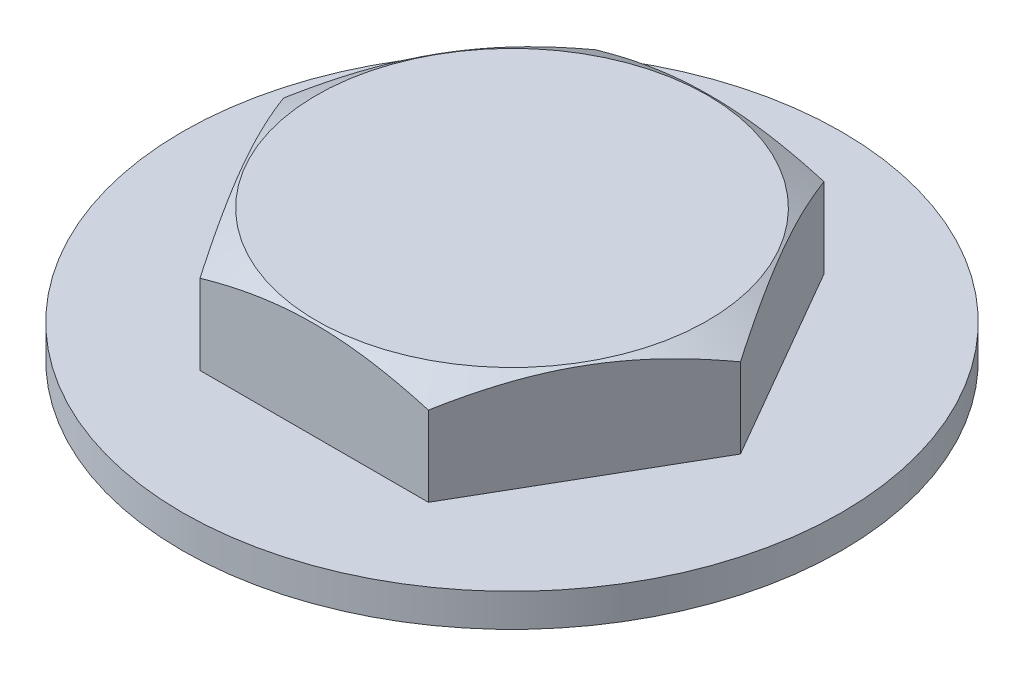
ISO-10303-21;
HEADER;
FILE_DESCRIPTION(('STEP AP214'),'2;1');
FILE_NAME('part.step','',(''),(''),'','','');
FILE_SCHEMA(('AUTOMOTIVE_DESIGN { 1 0 10303 214 1 1 1 1 }'));
ENDSEC;
DATA;
#1=APPLICATION_CONTEXT('core data for automotive mechanical design processes');
#2=APPLICATION_PROTOCOL_DEFINITION('international standard','automotive_design',2000,#1);
#3=PRODUCT_CONTEXT('',#1,'mechanical');
#4=PRODUCT('Part','Part','',(#3));
#5=PRODUCT_RELATED_PRODUCT_CATEGORY('part','',(#4));
#6=PRODUCT_DEFINITION_FORMATION('','',#4);
#7=PRODUCT_DEFINITION_CONTEXT('part definition',#1,'design');
#8=PRODUCT_DEFINITION('design','',#6,#7);
#9=PRODUCT_DEFINITION_SHAPE('','',#8);
#10=(LENGTH_UNIT() NAMED_UNIT(*) SI_UNIT(.MILLI.,.METRE.));
#11=(NAMED_UNIT(*) PLANE_ANGLE_UNIT() SI_UNIT($,.RADIAN.));
#12=(NAMED_UNIT(*) SI_UNIT($,.STERADIAN.) SOLID_ANGLE_UNIT());
#13=UNCERTAINTY_MEASURE_WITH_UNIT(LENGTH_MEASURE(1.E-05),#10,'distance_accuracy_value','');
#14=(GEOMETRIC_REPRESENTATION_CONTEXT(3) GLOBAL_UNCERTAINTY_ASSIGNED_CONTEXT((#13)) GLOBAL_UNIT_ASSIGNED_CONTEXT((#10,
#11,#12)) REPRESENTATION_CONTEXT('',''));
#15=CARTESIAN_POINT('',(0.,0.,0.));
#16=DIRECTION('',(0.,0.,1.));
#17=DIRECTION('',(1.,0.,0.));
#18=AXIS2_PLACEMENT_3D('',#15,#16,#17);
#19=CARTESIAN_POINT('',(6.92820323027551,9.,0.));
#20=DIRECTION('',(-0.866025403784439,0.,0.5));
#21=DIRECTION('',(0.5,0.,0.866025403784439));
#22=AXIS2_PLACEMENT_3D('',#19,#20,#21);
#23=PLANE('',#22);
#24=CARTESIAN_POINT('',(6.92831870032935,8.42258306247708,0.0002));
#25=CARTESIAN_POINT('',(6.85217369681759,8.4665391165567,-0.131687014824875));
#26=CARTESIAN_POINT('',(6.7757447877387,8.50850030845223,-0.264065768516574));
#27=CARTESIAN_POINT('',(6.62226628317934,8.58788353887784,-0.529898336283079));
#28=CARTESIAN_POINT('',(6.54521643511296,8.62530361927698,-0.66335258784951));
#29=CARTESIAN_POINT('',(6.31283321525997,8.73001770558644,-1.06585213146133));
#30=CARTESIAN_POINT('',(6.15658254390819,8.78957805829072,-1.33648623295937));
#31=CARTESIAN_POINT('',(5.92275625451824,8.85941990495739,-1.74148524632806));
#32=CARTESIAN_POINT('',(5.84587929350304,8.87931588762079,-1.87464004873788));
#33=CARTESIAN_POINT('',(5.69177799808122,8.91267870087366,-2.14155132192066));
#34=CARTESIAN_POINT('',(5.6145536949758,8.92614609951375,-2.27530773847834));
#35=CARTESIAN_POINT('',(5.45997096038123,8.94630852392226,-2.54305288876907));
#36=CARTESIAN_POINT('',(5.38261278137647,8.95301123567276,-2.67704118518633));
#37=CARTESIAN_POINT('',(5.22782922676438,8.9595077522625,-2.94513416595058));
#38=CARTESIAN_POINT('',(5.1504038533067,8.95930177052455,-3.07923884657427));
#39=CARTESIAN_POINT('',(4.93828180440546,8.94924093044691,-3.44664501267683));
#40=CARTESIAN_POINT('',(4.80365456051591,8.93235022267034,-3.6798262391765));
#41=CARTESIAN_POINT('',(4.53529425885134,8.87878889288205,-4.14463991639404));
#42=CARTESIAN_POINT('',(4.40156214490546,8.84209996270886,-4.3762707323519));
#43=CARTESIAN_POINT('',(4.13266173796312,8.75038798897692,-4.84201989935197));
#44=CARTESIAN_POINT('',(3.99752737632065,8.69497635896197,-5.07607947956512));
#45=CARTESIAN_POINT('',(3.7292739250165,8.56921420248924,-5.54070808652961));
#46=CARTESIAN_POINT('',(3.59615139973116,8.49889321835646,-5.77128306395569));
#47=CARTESIAN_POINT('',(3.46398614508392,8.42258306247708,-6.0002));
#48=B_SPLINE_CURVE_WITH_KNOTS('',3,(#24,#25,#26,#27,#28,#29,#30,#31,#32,#33,#34,#35,#36,#37,#38,
#39,#40,#41,#42,#43,#44,#45,#46,#47),.UNSPECIFIED.,.F.,.F.,(4,2,2,2,2,2,2,2,2,2,2,4),(0.,
0.475482194578525,0.951168694392475,1.90451835622161,2.36951738073402,2.83447530880776,
3.29890435872167,3.76331906154278,4.57182194271093,5.38107376137307,6.20827406017204,
7.03385036012983),.UNSPECIFIED.);
#49=CARTESIAN_POINT('',(6.92820323027551,8.42264973081038,0.));
#50=VERTEX_POINT('',#49);
#51=CARTESIAN_POINT('',(3.46410161513775,8.42264973081038,-6.));
#52=VERTEX_POINT('',#51);
#53=EDGE_CURVE('E87',#50,#52,#48,.T.);
#54=ORIENTED_EDGE('',*,*,#53,.F.);
#55=DIRECTION('',(0.,-1.,0.));
#56=VECTOR('',#55,1.);
#57=CARTESIAN_POINT('',(6.92820323027551,9.,0.));
#58=LINE('',#57,#56);
#59=CARTESIAN_POINT('',(6.92820323027551,6.,0.));
#60=VERTEX_POINT('',#59);
#61=EDGE_CURVE('E207',#50,#60,#58,.T.);
#62=ORIENTED_EDGE('',*,*,#61,.T.);
#63=DIRECTION('',(-0.5,0.,-0.866025403784439));
#64=VECTOR('',#63,1.);
#65=CARTESIAN_POINT('',(6.92820323027551,6.,0.));
#66=LINE('',#65,#64);
#67=CARTESIAN_POINT('',(3.46410161513776,6.,-6.));
#68=VERTEX_POINT('',#67);
#69=EDGE_CURVE('E96',#60,#68,#66,.T.);
#70=ORIENTED_EDGE('',*,*,#69,.T.);
#71=DIRECTION('',(0.,-1.,0.));
#72=VECTOR('',#71,1.);
#73=CARTESIAN_POINT('',(3.46410161513776,9.,-6.));
#74=LINE('',#73,#72);
#75=EDGE_CURVE('E102',#52,#68,#74,.T.);
#76=ORIENTED_EDGE('',*,*,#75,.F.);
#77=EDGE_LOOP('',(#54,#62,#70,#76));
#78=FACE_BOUND('',#77,.T.);
#79=ADVANCED_FACE('F35',(#78),#23,.F.);
#80=CARTESIAN_POINT('',(3.46410161513776,9.,-6.));
#81=DIRECTION('',(0.,0.,1.));
#82=DIRECTION('',(1.,0.,0.));
#83=AXIS2_PLACEMENT_3D('',#80,#81,#82);
#84=PLANE('',#83);
#85=CARTESIAN_POINT('',(-9.18155979278431,6.0901662730488,-6.));
#86=CARTESIAN_POINT('',(-8.91817057292794,6.21742661186947,-6.00000000000001));
#87=CARTESIAN_POINT('',(-8.65415796087463,6.34342011400239,-6.));
#88=CARTESIAN_POINT('',(-8.1245488596116,6.59214939801971,-6.));
#89=CARTESIAN_POINT('',(-7.85895210517941,6.71488461450858,-6.));
#90=CARTESIAN_POINT('',(-7.32440005407077,6.95702111119331,-6.));
#91=CARTESIAN_POINT('',(-7.05543423199034,7.07639923901043,-6.));
#92=CARTESIAN_POINT('',(-6.51528978405492,7.31001962095316,-6.));
#93=CARTESIAN_POINT('',(-6.24411127463008,7.42426214327798,-6.));
#94=CARTESIAN_POINT('',(-5.69577052259945,7.64759078549939,-6.));
#95=CARTESIAN_POINT('',(-5.41857562669318,7.75659717031044,-6.));
#96=CARTESIAN_POINT('',(-4.8609140407229,7.96605816039962,-6.));
#97=CARTESIAN_POINT('',(-4.58044699032054,8.06651181352566,-6.));
#98=CARTESIAN_POINT('',(-4.01637385547205,8.25616425678339,-6.));
#99=CARTESIAN_POINT('',(-3.73277591464178,8.34538702480316,-6.));
#100=CARTESIAN_POINT('',(-3.16154566557754,8.5096752686121,-6.));
#101=CARTESIAN_POINT('',(-2.87391466593935,8.58474522732167,-6.));
#102=CARTESIAN_POINT('',(-2.2944333403369,8.7170841852823,-6.));
#103=CARTESIAN_POINT('',(-2.00258184290511,8.77434813893941,-6.));
#104=CARTESIAN_POINT('',(-1.41532571311818,8.86720016945625,-6.));
#105=CARTESIAN_POINT('',(-1.11992107657199,8.90278822074593,-6.));
#106=CARTESIAN_POINT('',(-0.676347487619417,8.93763187482261,-6.));
#107=CARTESIAN_POINT('',(-0.528869276347276,8.94615863808684,-6.));
#108=CARTESIAN_POINT('',(-0.23367733354004,8.95696351543254,-6.));
#109=CARTESIAN_POINT('',(-0.085963605064501,8.95924171003672,-6.));
#110=CARTESIAN_POINT('',(0.209383789813805,8.95748809293757,-6.));
#111=CARTESIAN_POINT('',(0.357017467054356,8.9534580450339,-6.));
#112=CARTESIAN_POINT('',(0.651986899102891,8.93918988857407,-6.));
#113=CARTESIAN_POINT('',(0.799322638772218,8.92895147213777,-6.));
#114=CARTESIAN_POINT('',(1.15660382386368,8.89680897735207,-6.));
#115=CARTESIAN_POINT('',(1.36627301023458,8.87178371672604,-6.));
#116=CARTESIAN_POINT('',(1.78400086740359,8.81055021668872,-6.));
#117=CARTESIAN_POINT('',(1.99205908203469,8.77433892055754,-6.));
#118=CARTESIAN_POINT('',(2.40639458979388,8.69201764924662,-6.));
#119=CARTESIAN_POINT('',(2.61267000272928,8.6458983005421,-6.));
#120=CARTESIAN_POINT('',(3.02309673406924,8.54516776349629,-6.));
#121=CARTESIAN_POINT('',(3.22724825081131,8.49055737581443,-6.));
#122=CARTESIAN_POINT('',(3.63844742413069,8.37272567613287,-6.));
#123=CARTESIAN_POINT('',(3.84544372179669,8.30932636667262,-6.));
#124=CARTESIAN_POINT('',(4.25724824230678,8.17627579128802,-6.));
#125=CARTESIAN_POINT('',(4.46205786820143,8.10662884218655,-6.));
#126=CARTESIAN_POINT('',(4.86866710614086,7.96252058451717,-6.));
#127=CARTESIAN_POINT('',(5.0704771745006,7.88808860245289,-6.));
#128=CARTESIAN_POINT('',(5.47253258896724,7.73486381495592,-6.));
#129=CARTESIAN_POINT('',(5.67277726286603,7.65606924218204,-6.));
#130=CARTESIAN_POINT('',(5.87229501012278,7.5755251988185,-6.));
#131=B_SPLINE_CURVE_WITH_KNOTS('',3,(#85,#86,#87,#88,#89,#90,#91,#92,#93,#94,#95,#96,#97,#98,
#99,#100,#101,#102,#103,#104,#105,#106,#107,#108,#109,#110,#111,#112,#113,#114,#115,#116,#117,
#118,#119,#120,#121,#122,#123,#124,#125,#126,#127,#128,#129,#130),.UNSPECIFIED.,.F.,.F.,(4,2,2,
2,2,2,2,2,2,2,2,2,2,2,2,2,2,2,2,2,2,2,4),(0.,0.877577581619978,1.75530646288022,
2.63806827982896,3.52078394219835,4.41424907460538,5.30781354432239,6.19943667791494,
7.09077691248349,7.982369491756,8.87396312279649,9.31702416530839,9.76007949824917,
10.2030109739873,10.6459644170039,11.2790836753903,11.9123760945658,12.546270300051,
13.180104768923,13.8294478650386,14.4783457017828,15.1235886132837,15.7690948612457),.UNSPECIFIED.);
#132=CARTESIAN_POINT('',(-3.46410161513776,8.42264973081038,-6.));
#133=VERTEX_POINT('',#132);
#134=EDGE_CURVE('E90',#52,#133,#131,.F.);
#135=ORIENTED_EDGE('',*,*,#134,.F.);
#136=ORIENTED_EDGE('',*,*,#75,.T.);
#137=DIRECTION('',(-1.,0.,0.));
#138=VECTOR('',#137,1.);
#139=CARTESIAN_POINT('',(3.46410161513776,6.,-6.));
#140=LINE('',#139,#138);
#141=CARTESIAN_POINT('',(-3.46410161513775,6.,-6.));
#142=VERTEX_POINT('',#141);
#143=EDGE_CURVE('E228',#68,#142,#140,.T.);
#144=ORIENTED_EDGE('',*,*,#143,.T.);
#145=DIRECTION('',(0.,-1.,0.));
#146=VECTOR('',#145,1.);
#147=CARTESIAN_POINT('',(-3.46410161513775,9.,-6.));
#148=LINE('',#147,#146);
#149=EDGE_CURVE('E104',#133,#142,#148,.T.);
#150=ORIENTED_EDGE('',*,*,#149,.F.);
#151=EDGE_LOOP('',(#135,#136,#144,#150));
#152=FACE_BOUND('',#151,.T.);
#153=ADVANCED_FACE('F100',(#152),#84,.F.);
#154=CARTESIAN_POINT('',(-3.46410161513775,9.,-6.));
#155=DIRECTION('',(0.866025403784439,0.,0.5));
#156=DIRECTION('',(0.5,0.,-0.866025403784439));
#157=AXIS2_PLACEMENT_3D('',#154,#155,#156);
#158=PLANE('',#157);
#159=CARTESIAN_POINT('',(-3.46398614508392,8.42258306247708,-6.0002));
#160=CARTESIAN_POINT('',(-3.54013114859567,8.4665391165567,-5.86831298517513));
#161=CARTESIAN_POINT('',(-3.61656005767456,8.50850030845222,-5.73593423148343));
#162=CARTESIAN_POINT('',(-3.77003856223392,8.58788353887784,-5.47010166371692));
#163=CARTESIAN_POINT('',(-3.8470884103003,8.62530361927698,-5.33664741215049));
#164=CARTESIAN_POINT('',(-4.07947163015329,8.73001770558645,-4.93414786853867));
#165=CARTESIAN_POINT('',(-4.23572230150508,8.78957805829072,-4.66351376704063));
#166=CARTESIAN_POINT('',(-4.46954859089502,8.85941990495739,-4.25851475367194));
#167=CARTESIAN_POINT('',(-4.54642555191022,8.87931588762079,-4.12535995126212));
#168=CARTESIAN_POINT('',(-4.70052684733205,8.91267870087366,-3.85844867807934));
#169=CARTESIAN_POINT('',(-4.77775115043746,8.92614609951375,-3.72469226152166));
#170=CARTESIAN_POINT('',(-4.93233388503203,8.94630852392226,-3.45694711123093));
#171=CARTESIAN_POINT('',(-5.00969206403679,8.95301123567276,-3.32295881481368));
#172=CARTESIAN_POINT('',(-5.16447561864888,8.9595077522625,-3.05486583404942));
#173=CARTESIAN_POINT('',(-5.24190099210656,8.95930177052455,-2.92076115342573));
#174=CARTESIAN_POINT('',(-5.4540230410078,8.94924093044691,-2.55335498732317));
#175=CARTESIAN_POINT('',(-5.58865028489735,8.93235022267034,-2.3201737608235));
#176=CARTESIAN_POINT('',(-5.85701058656192,8.87878889288205,-1.85536008360596));
#177=CARTESIAN_POINT('',(-5.9907427005078,8.84209996270886,-1.6237292676481));
#178=CARTESIAN_POINT('',(-6.25964310745014,8.75038798897692,-1.15798010064803));
#179=CARTESIAN_POINT('',(-6.39477746909261,8.69497635896197,-0.923920520434879));
#180=CARTESIAN_POINT('',(-6.66303092039676,8.56921420248924,-0.459291913470391));
#181=CARTESIAN_POINT('',(-6.7961534456821,8.49889321835646,-0.22871693604431));
#182=CARTESIAN_POINT('',(-6.92831870032935,8.42258306247708,0.000199999999999847));
#183=B_SPLINE_CURVE_WITH_KNOTS('',3,(#159,#160,#161,#162,#163,#164,#165,#166,#167,#168,#169,
#170,#171,#172,#173,#174,#175,#176,#177,#178,#179,#180,#181,#182),.UNSPECIFIED.,.F.,.F.,(4,2,2,
2,2,2,2,2,2,2,2,4),(0.,0.475482194578524,0.951168694392474,1.90451835622161,2.36951738073402,
2.83447530880776,3.29890435872167,3.76331906154278,4.57182194271094,5.38107376137307,
6.20827406017204,7.03385036012984),.UNSPECIFIED.);
#184=CARTESIAN_POINT('',(-6.92820323027551,8.42264973081038,0.));
#185=VERTEX_POINT('',#184);
#186=EDGE_CURVE('E105',#133,#185,#183,.T.);
#187=ORIENTED_EDGE('',*,*,#186,.F.);
#188=ORIENTED_EDGE('',*,*,#149,.T.);
#189=DIRECTION('',(-0.5,0.,0.866025403784439));
#190=VECTOR('',#189,1.);
#191=CARTESIAN_POINT('',(-3.46410161513775,6.,-6.));
#192=LINE('',#191,#190);
#193=CARTESIAN_POINT('',(-6.92820323027551,6.,0.));
#194=VERTEX_POINT('',#193);
#195=EDGE_CURVE('E226',#142,#194,#192,.T.);
#196=ORIENTED_EDGE('',*,*,#195,.T.);
#197=DIRECTION('',(0.,-1.,0.));
#198=VECTOR('',#197,1.);
#199=CARTESIAN_POINT('',(-6.92820323027551,9.,0.));
#200=LINE('',#199,#198);
#201=EDGE_CURVE('E114',#185,#194,#200,.T.);
#202=ORIENTED_EDGE('',*,*,#201,.F.);
#203=EDGE_LOOP('',(#187,#188,#196,#202));
#204=FACE_BOUND('',#203,.T.);
#205=ADVANCED_FACE('F142',(#204),#158,.F.);
#206=CARTESIAN_POINT('',(-6.92820323027551,9.,0.));
#207=DIRECTION('',(0.866025403784439,0.,-0.5));
#208=DIRECTION('',(-0.5,0.,-0.866025403784439));
#209=AXIS2_PLACEMENT_3D('',#206,#207,#208);
#210=PLANE('',#209);
#211=CARTESIAN_POINT('',(-6.92831870032935,8.42258306247708,-0.000199999999999524));
#212=CARTESIAN_POINT('',(-6.85217369681759,8.4665391165567,0.131687014824876));
#213=CARTESIAN_POINT('',(-6.7757447877387,8.50850030845223,0.264065768516574));
#214=CARTESIAN_POINT('',(-6.62226628317934,8.58788353887784,0.52989833628308));
#215=CARTESIAN_POINT('',(-6.54521643511296,8.62530361927698,0.663352587849511));
#216=CARTESIAN_POINT('',(-6.31283321525997,8.73001770558644,1.06585213146133));
#217=CARTESIAN_POINT('',(-6.15658254390818,8.78957805829072,1.33648623295938));
#218=CARTESIAN_POINT('',(-5.92275625451824,8.85941990495739,1.74148524632806));
#219=CARTESIAN_POINT('',(-5.84587929350304,8.87931588762079,1.87464004873788));
#220=CARTESIAN_POINT('',(-5.69177799808122,8.91267870087366,2.14155132192066));
#221=CARTESIAN_POINT('',(-5.6145536949758,8.92614609951375,2.27530773847834));
#222=CARTESIAN_POINT('',(-5.45997096038123,8.94630852392226,2.54305288876907));
#223=CARTESIAN_POINT('',(-5.38261278137647,8.95301123567276,2.67704118518633));
#224=CARTESIAN_POINT('',(-5.22782922676438,8.9595077522625,2.94513416595058));
#225=CARTESIAN_POINT('',(-5.1504038533067,8.95930177052455,3.07923884657427));
#226=CARTESIAN_POINT('',(-4.93828180440546,8.94924093044691,3.44664501267683));
#227=CARTESIAN_POINT('',(-4.80365456051591,8.93235022267034,3.6798262391765));
#228=CARTESIAN_POINT('',(-4.53529425885134,8.87878889288205,4.14463991639404));
#229=CARTESIAN_POINT('',(-4.40156214490546,8.84209996270886,4.3762707323519));
#230=CARTESIAN_POINT('',(-4.13266173796312,8.75038798897692,4.84201989935197));
#231=CARTESIAN_POINT('',(-3.99752737632065,8.69497635896197,5.07607947956512));
#232=CARTESIAN_POINT('',(-3.7292739250165,8.56921420248924,5.54070808652961));
#233=CARTESIAN_POINT('',(-3.59615139973116,8.49889321835645,5.77128306395569));
#234=CARTESIAN_POINT('',(-3.46398614508392,8.42258306247708,6.0002));
#235=B_SPLINE_CURVE_WITH_KNOTS('',3,(#211,#212,#213,#214,#215,#216,#217,#218,#219,#220,#221,
#222,#223,#224,#225,#226,#227,#228,#229,#230,#231,#232,#233,#234),.UNSPECIFIED.,.F.,.F.,(4,2,2,
2,2,2,2,2,2,2,2,4),(0.,0.475482194578525,0.951168694392475,1.90451835622161,2.36951738073402,
2.83447530880776,3.29890435872167,3.76331906154278,4.57182194271093,5.38107376137307,
6.20827406017203,7.03385036012983),.UNSPECIFIED.);
#236=CARTESIAN_POINT('',(-3.46410161513775,8.42264973081038,6.));
#237=VERTEX_POINT('',#236);
#238=EDGE_CURVE('E181',#185,#237,#235,.T.);
#239=ORIENTED_EDGE('',*,*,#238,.F.);
#240=ORIENTED_EDGE('',*,*,#201,.T.);
#241=DIRECTION('',(0.5,0.,0.866025403784439));
#242=VECTOR('',#241,1.);
#243=CARTESIAN_POINT('',(-6.92820323027551,6.,0.));
#244=LINE('',#243,#242);
#245=CARTESIAN_POINT('',(-3.46410161513776,6.,6.));
#246=VERTEX_POINT('',#245);
#247=EDGE_CURVE('E224',#194,#246,#244,.T.);
#248=ORIENTED_EDGE('',*,*,#247,.T.);
#249=DIRECTION('',(0.,-1.,0.));
#250=VECTOR('',#249,1.);
#251=CARTESIAN_POINT('',(-3.46410161513776,9.,6.));
#252=LINE('',#251,#250);
#253=EDGE_CURVE('E213',#237,#246,#252,.T.);
#254=ORIENTED_EDGE('',*,*,#253,.F.);
#255=EDGE_LOOP('',(#239,#240,#248,#254));
#256=FACE_BOUND('',#255,.T.);
#257=ADVANCED_FACE('F191',(#256),#210,.F.);
#258=CARTESIAN_POINT('',(-3.46410161513776,9.,6.));
#259=DIRECTION('',(0.,0.,-1.));
#260=DIRECTION('',(-1.,0.,0.));
#261=AXIS2_PLACEMENT_3D('',#258,#259,#260);
#262=PLANE('',#261);
#263=CARTESIAN_POINT('',(-9.18155979278431,6.0901662730488,6.));
#264=CARTESIAN_POINT('',(-8.91817057292794,6.21742661186947,6.));
#265=CARTESIAN_POINT('',(-8.65415796087463,6.34342011400239,6.));
#266=CARTESIAN_POINT('',(-8.1245488596116,6.59214939801971,6.));
#267=CARTESIAN_POINT('',(-7.85895210517941,6.71488461450858,6.));
#268=CARTESIAN_POINT('',(-7.32440005407077,6.95702111119332,6.));
#269=CARTESIAN_POINT('',(-7.05543423199034,7.07639923901043,6.));
#270=CARTESIAN_POINT('',(-6.51528978405492,7.31001962095317,6.));
#271=CARTESIAN_POINT('',(-6.24411127463008,7.42426214327798,6.));
#272=CARTESIAN_POINT('',(-5.69577052259945,7.64759078549939,6.));
#273=CARTESIAN_POINT('',(-5.41857562669319,7.75659717031044,6.));
#274=CARTESIAN_POINT('',(-4.8609140407229,7.96605816039962,6.));
#275=CARTESIAN_POINT('',(-4.58044699032054,8.06651181352566,6.));
#276=CARTESIAN_POINT('',(-4.01637385547206,8.25616425678339,6.));
#277=CARTESIAN_POINT('',(-3.73277591464178,8.34538702480316,6.));
#278=CARTESIAN_POINT('',(-3.16154566557754,8.5096752686121,6.));
#279=CARTESIAN_POINT('',(-2.87391466593935,8.58474522732168,6.));
#280=CARTESIAN_POINT('',(-2.2944333403369,8.7170841852823,6.));
#281=CARTESIAN_POINT('',(-2.00258184290511,8.77434813893941,6.));
#282=CARTESIAN_POINT('',(-1.41532571311818,8.86720016945625,6.));
#283=CARTESIAN_POINT('',(-1.11992107657199,8.90278822074593,6.));
#284=CARTESIAN_POINT('',(-0.676347487619418,8.93763187482261,6.));
#285=CARTESIAN_POINT('',(-0.528869276347278,8.94615863808684,6.));
#286=CARTESIAN_POINT('',(-0.233677333540042,8.95696351543254,6.));
#287=CARTESIAN_POINT('',(-0.0859636050645032,8.95924171003672,6.));
#288=CARTESIAN_POINT('',(0.209383789813802,8.95748809293757,6.));
#289=CARTESIAN_POINT('',(0.357017467054352,8.9534580450339,6.));
#290=CARTESIAN_POINT('',(0.651986899102887,8.93918988857407,6.));
#291=CARTESIAN_POINT('',(0.799322638772215,8.92895147213777,6.));
#292=CARTESIAN_POINT('',(1.15660382386367,8.89680897735207,6.));
#293=CARTESIAN_POINT('',(1.36627301023457,8.87178371672604,6.));
#294=CARTESIAN_POINT('',(1.78400086740359,8.81055021668872,6.));
#295=CARTESIAN_POINT('',(1.99205908203469,8.77433892055753,6.));
#296=CARTESIAN_POINT('',(2.40639458979387,8.69201764924662,6.));
#297=CARTESIAN_POINT('',(2.61267000272928,8.6458983005421,6.));
#298=CARTESIAN_POINT('',(3.02309673406924,8.54516776349629,6.));
#299=CARTESIAN_POINT('',(3.22724825081131,8.49055737581443,6.));
#300=CARTESIAN_POINT('',(3.63844742413069,8.37272567613287,6.));
#301=CARTESIAN_POINT('',(3.84544372179669,8.30932636667262,6.));
#302=CARTESIAN_POINT('',(4.25724824230678,8.17627579128802,6.));
#303=CARTESIAN_POINT('',(4.46205786820143,8.10662884218655,6.));
#304=CARTESIAN_POINT('',(4.86866710614086,7.96252058451717,6.));
#305=CARTESIAN_POINT('',(5.07047717450059,7.88808860245289,6.));
#306=CARTESIAN_POINT('',(5.47253258896724,7.73486381495592,6.));
#307=CARTESIAN_POINT('',(5.67277726286603,7.65606924218204,6.));
#308=CARTESIAN_POINT('',(5.87229501012278,7.5755251988185,6.));
#309=B_SPLINE_CURVE_WITH_KNOTS('',3,(#263,#264,#265,#266,#267,#268,#269,#270,#271,#272,#273,
#274,#275,#276,#277,#278,#279,#280,#281,#282,#283,#284,#285,#286,#287,#288,#289,#290,#291,#292,
#293,#294,#295,#296,#297,#298,#299,#300,#301,#302,#303,#304,#305,#306,#307,#308),.UNSPECIFIED.,
.F.,.F.,(4,2,2,2,2,2,2,2,2,2,2,2,2,2,2,2,2,2,2,2,2,2,4),(0.,0.877577581619978,1.75530646288022,
2.63806827982896,3.52078394219834,4.41424907460537,5.30781354432238,6.19943667791493,
7.09077691248349,7.982369491756,8.87396312279649,9.31702416530839,9.76007949824917,
10.2030109739873,10.6459644170039,11.2790836753903,11.9123760945658,12.546270300051,
13.180104768923,13.8294478650386,14.4783457017828,15.1235886132837,15.7690948612457),.UNSPECIFIED.);
#310=CARTESIAN_POINT('',(3.46410161513776,8.42264973081038,6.));
#311=VERTEX_POINT('',#310);
#312=EDGE_CURVE('E50',#237,#311,#309,.T.);
#313=ORIENTED_EDGE('',*,*,#312,.F.);
#314=ORIENTED_EDGE('',*,*,#253,.T.);
#315=DIRECTION('',(1.,0.,0.));
#316=VECTOR('',#315,1.);
#317=CARTESIAN_POINT('',(-3.46410161513776,6.,6.));
#318=LINE('',#317,#316);
#319=CARTESIAN_POINT('',(3.46410161513776,6.,6.));
#320=VERTEX_POINT('',#319);
#321=EDGE_CURVE('E211',#246,#320,#318,.T.);
#322=ORIENTED_EDGE('',*,*,#321,.T.);
#323=DIRECTION('',(0.,-1.,0.));
#324=VECTOR('',#323,1.);
#325=CARTESIAN_POINT('',(3.46410161513776,9.,6.));
#326=LINE('',#325,#324);
#327=EDGE_CURVE('E57',#311,#320,#326,.T.);
#328=ORIENTED_EDGE('',*,*,#327,.F.);
#329=EDGE_LOOP('',(#313,#314,#322,#328));
#330=FACE_BOUND('',#329,.T.);
#331=ADVANCED_FACE('F195',(#330),#262,.F.);
#332=CARTESIAN_POINT('',(3.46410161513776,9.,6.));
#333=DIRECTION('',(-0.866025403784439,0.,-0.5));
#334=DIRECTION('',(-0.5,0.,0.866025403784439));
#335=AXIS2_PLACEMENT_3D('',#332,#333,#334);
#336=PLANE('',#335);
#337=CARTESIAN_POINT('',(3.46398614508392,8.42258306247708,6.0002));
#338=CARTESIAN_POINT('',(3.54013114859568,8.4665391165567,5.86831298517513));
#339=CARTESIAN_POINT('',(3.61656005767457,8.50850030845223,5.73593423148343));
#340=CARTESIAN_POINT('',(3.77003856223393,8.58788353887784,5.47010166371692));
#341=CARTESIAN_POINT('',(3.84708841030031,8.62530361927698,5.33664741215049));
#342=CARTESIAN_POINT('',(4.07947163015329,8.73001770558644,4.93414786853867));
#343=CARTESIAN_POINT('',(4.23572230150508,8.78957805829072,4.66351376704063));
#344=CARTESIAN_POINT('',(4.46954859089502,8.85941990495739,4.25851475367194));
#345=CARTESIAN_POINT('',(4.54642555191022,8.87931588762079,4.12535995126212));
#346=CARTESIAN_POINT('',(4.70052684733205,8.91267870087366,3.85844867807934));
#347=CARTESIAN_POINT('',(4.77775115043746,8.92614609951375,3.72469226152166));
#348=CARTESIAN_POINT('',(4.93233388503203,8.94630852392226,3.45694711123093));
#349=CARTESIAN_POINT('',(5.0096920640368,8.95301123567276,3.32295881481367));
#350=CARTESIAN_POINT('',(5.16447561864889,8.9595077522625,3.05486583404942));
#351=CARTESIAN_POINT('',(5.24190099210656,8.95930177052455,2.92076115342573));
#352=CARTESIAN_POINT('',(5.4540230410078,8.94924093044691,2.55335498732317));
#353=CARTESIAN_POINT('',(5.58865028489735,8.93235022267034,2.3201737608235));
#354=CARTESIAN_POINT('',(5.85701058656192,8.87878889288205,1.85536008360596));
#355=CARTESIAN_POINT('',(5.9907427005078,8.84209996270886,1.6237292676481));
#356=CARTESIAN_POINT('',(6.25964310745014,8.75038798897692,1.15798010064803));
#357=CARTESIAN_POINT('',(6.39477746909261,8.69497635896197,0.923920520434879));
#358=CARTESIAN_POINT('',(6.66303092039676,8.56921420248924,0.459291913470391));
#359=CARTESIAN_POINT('',(6.7961534456821,8.49889321835646,0.22871693604431));
#360=CARTESIAN_POINT('',(6.92831870032935,8.42258306247708,-0.000200000000000001));
#361=B_SPLINE_CURVE_WITH_KNOTS('',3,(#337,#338,#339,#340,#341,#342,#343,#344,#345,#346,#347,
#348,#349,#350,#351,#352,#353,#354,#355,#356,#357,#358,#359,#360),.UNSPECIFIED.,.F.,.F.,(4,2,2,
2,2,2,2,2,2,2,2,4),(0.,0.475482194578525,0.951168694392476,1.90451835622161,2.36951738073402,
2.83447530880776,3.29890435872167,3.76331906154278,4.57182194271094,5.38107376137307,
6.20827406017204,7.03385036012983),.UNSPECIFIED.);
#362=EDGE_CURVE('E92',#311,#50,#361,.T.);
#363=ORIENTED_EDGE('',*,*,#362,.F.);
#364=ORIENTED_EDGE('',*,*,#327,.T.);
#365=DIRECTION('',(0.5,0.,-0.866025403784439));
#366=VECTOR('',#365,1.);
#367=CARTESIAN_POINT('',(3.46410161513776,6.,6.));
#368=LINE('',#367,#366);
#369=EDGE_CURVE('E216',#320,#60,#368,.T.);
#370=ORIENTED_EDGE('',*,*,#369,.T.);
#371=ORIENTED_EDGE('',*,*,#61,.F.);
#372=EDGE_LOOP('',(#363,#364,#370,#371));
#373=FACE_BOUND('',#372,.T.);
#374=ADVANCED_FACE('F199',(#373),#336,.F.);
#375=CARTESIAN_POINT('',(0.,6.,0.));
#376=DIRECTION('',(0.,1.,0.));
#377=DIRECTION('',(0.,0.,1.));
#378=AXIS2_PLACEMENT_3D('',#375,#376,#377);
#379=PLANE('',#378);
#380=CARTESIAN_POINT('',(0.,6.,0.));
#381=DIRECTION('',(0.,1.,0.));
#382=DIRECTION('',(0.,0.,1.));
#383=AXIS2_PLACEMENT_3D('',#380,#381,#382);
#384=CIRCLE('',#383,10.);
#385=CARTESIAN_POINT('',(0.,6.,10.));
#386=VERTEX_POINT('',#385);
#387=EDGE_CURVE('E112',#386,#386,#384,.T.);
#388=ORIENTED_EDGE('',*,*,#387,.T.);
#389=EDGE_LOOP('',(#388));
#390=FACE_BOUND('',#389,.T.);
#391=ORIENTED_EDGE('',*,*,#143,.F.);
#392=ORIENTED_EDGE('',*,*,#69,.F.);
#393=ORIENTED_EDGE('',*,*,#369,.F.);
#394=ORIENTED_EDGE('',*,*,#321,.F.);
#395=ORIENTED_EDGE('',*,*,#247,.F.);
#396=ORIENTED_EDGE('',*,*,#195,.F.);
#397=EDGE_LOOP('',(#391,#392,#393,#394,#395,#396));
#398=FACE_BOUND('',#397,.T.);
#399=ADVANCED_FACE('F148',(#390,#398),#379,.T.);
#400=CARTESIAN_POINT('',(0.,5.,0.));
#401=DIRECTION('',(0.,-1.,0.));
#402=DIRECTION('',(0.,0.,-1.));
#403=AXIS2_PLACEMENT_3D('',#400,#401,#402);
#404=CYLINDRICAL_SURFACE('',#403,2.5);
#405=CARTESIAN_POINT('',(0.,0.500000000000003,0.));
#406=DIRECTION('',(0.,1.,0.));
#407=DIRECTION('',(0.,0.,1.));
#408=AXIS2_PLACEMENT_3D('',#405,#406,#407);
#409=CIRCLE('',#408,2.5);
#410=CARTESIAN_POINT('',(0.,0.500000000000003,2.5));
#411=VERTEX_POINT('',#410);
#412=EDGE_CURVE('E43',#411,#411,#409,.T.);
#413=ORIENTED_EDGE('',*,*,#412,.T.);
#414=EDGE_LOOP('',(#413));
#415=FACE_BOUND('',#414,.T.);
#416=CARTESIAN_POINT('',(0.,5.,0.));
#417=DIRECTION('',(0.,1.,0.));
#418=DIRECTION('',(0.,0.,1.));
#419=AXIS2_PLACEMENT_3D('',#416,#417,#418);
#420=CIRCLE('',#419,2.5);
#421=CARTESIAN_POINT('',(0.,5.,2.5));
#422=VERTEX_POINT('',#421);
#423=EDGE_CURVE('E119',#422,#422,#420,.T.);
#424=ORIENTED_EDGE('',*,*,#423,.F.);
#425=EDGE_LOOP('',(#424));
#426=FACE_BOUND('',#425,.T.);
#427=ADVANCED_FACE('F125',(#415,#426),#404,.T.);
#428=CARTESIAN_POINT('',(0.,0.,0.));
#429=DIRECTION('',(0.,1.,0.));
#430=DIRECTION('',(0.,0.,1.));
#431=AXIS2_PLACEMENT_3D('',#428,#429,#430);
#432=PLANE('',#431);
#433=CARTESIAN_POINT('',(0.,0.,0.));
#434=DIRECTION('',(0.,1.,0.));
#435=DIRECTION('',(0.,0.,1.));
#436=AXIS2_PLACEMENT_3D('',#433,#434,#435);
#437=CIRCLE('',#436,1.99999999999999);
#438=CARTESIAN_POINT('',(0.,0.,1.99999999999999));
#439=VERTEX_POINT('',#438);
#440=EDGE_CURVE('E11',#439,#439,#437,.F.);
#441=ORIENTED_EDGE('',*,*,#440,.T.);
#442=EDGE_LOOP('',(#441));
#443=FACE_BOUND('',#442,.T.);
#444=ADVANCED_FACE('F238',(#443),#432,.F.);
#445=CARTESIAN_POINT('',(0.,6.,0.));
#446=DIRECTION('',(0.,-1.,0.));
#447=DIRECTION('',(0.,0.,-1.));
#448=AXIS2_PLACEMENT_3D('',#445,#446,#447);
#449=CYLINDRICAL_SURFACE('',#448,10.);
#450=ORIENTED_EDGE('',*,*,#387,.F.);
#451=EDGE_LOOP('',(#450));
#452=FACE_BOUND('',#451,.T.);
#453=CARTESIAN_POINT('',(0.,5.,0.));
#454=DIRECTION('',(0.,1.,0.));
#455=DIRECTION('',(0.,0.,1.));
#456=AXIS2_PLACEMENT_3D('',#453,#454,#455);
#457=CIRCLE('',#456,10.);
#458=CARTESIAN_POINT('',(0.,5.,10.));
#459=VERTEX_POINT('',#458);
#460=EDGE_CURVE('E109',#459,#459,#457,.T.);
#461=ORIENTED_EDGE('',*,*,#460,.T.);
#462=EDGE_LOOP('',(#461));
#463=FACE_BOUND('',#462,.T.);
#464=ADVANCED_FACE('F241',(#452,#463),#449,.T.);
#465=CARTESIAN_POINT('',(0.,5.,0.));
#466=DIRECTION('',(0.,1.,0.));
#467=DIRECTION('',(0.,0.,1.));
#468=AXIS2_PLACEMENT_3D('',#465,#466,#467);
#469=PLANE('',#468);
#470=ORIENTED_EDGE('',*,*,#423,.T.);
#471=EDGE_LOOP('',(#470));
#472=FACE_BOUND('',#471,.T.);
#473=ORIENTED_EDGE('',*,*,#460,.F.);
#474=EDGE_LOOP('',(#473));
#475=FACE_BOUND('',#474,.T.);
#476=ADVANCED_FACE('F162',(#472,#475),#469,.F.);
#477=CARTESIAN_POINT('',(0.,8.42264973081038,0.));
#478=DIRECTION('',(0.,-1.,0.));
#479=DIRECTION('',(0.,0.,-1.));
#480=AXIS2_PLACEMENT_3D('',#477,#478,#479);
#481=CONICAL_SURFACE('',#480,6.92820323027551,1.0471975511966);
#482=CARTESIAN_POINT('',(0.,9.,0.));
#483=DIRECTION('',(0.,-1.,0.));
#484=DIRECTION('',(0.,0.,-1.));
#485=AXIS2_PLACEMENT_3D('',#482,#483,#484);
#486=CIRCLE('',#485,5.92820323027551);
#487=CARTESIAN_POINT('',(0.,9.,-5.92820323027551));
#488=VERTEX_POINT('',#487);
#489=EDGE_CURVE('E208',#488,#488,#486,.T.);
#490=ORIENTED_EDGE('',*,*,#489,.T.);
#491=EDGE_LOOP('',(#490));
#492=FACE_BOUND('',#491,.T.);
#493=ORIENTED_EDGE('',*,*,#53,.T.);
#494=ORIENTED_EDGE('',*,*,#134,.T.);
#495=ORIENTED_EDGE('',*,*,#186,.T.);
#496=ORIENTED_EDGE('',*,*,#238,.T.);
#497=ORIENTED_EDGE('',*,*,#312,.T.);
#498=ORIENTED_EDGE('',*,*,#362,.T.);
#499=EDGE_LOOP('',(#493,#494,#495,#496,#497,#498));
#500=FACE_BOUND('',#499,.T.);
#501=ADVANCED_FACE('F89',(#492,#500),#481,.T.);
#502=CARTESIAN_POINT('',(0.,9.,0.));
#503=DIRECTION('',(0.,1.,0.));
#504=DIRECTION('',(0.,0.,1.));
#505=AXIS2_PLACEMENT_3D('',#502,#503,#504);
#506=PLANE('',#505);
#507=ORIENTED_EDGE('',*,*,#489,.F.);
#508=EDGE_LOOP('',(#507));
#509=FACE_BOUND('',#508,.T.);
#510=ADVANCED_FACE('F129',(#509),#506,.T.);
#511=CARTESIAN_POINT('',(0.,0.500000000000003,0.));
#512=DIRECTION('',(0.,1.,0.));
#513=DIRECTION('',(0.,0.,1.));
#514=AXIS2_PLACEMENT_3D('',#511,#512,#513);
#515=CONICAL_SURFACE('',#514,2.5,0.78539816339745);
#516=ORIENTED_EDGE('',*,*,#440,.F.);
#517=EDGE_LOOP('',(#516));
#518=FACE_BOUND('',#517,.T.);
#519=ORIENTED_EDGE('',*,*,#412,.F.);
#520=EDGE_LOOP('',(#519));
#521=FACE_BOUND('',#520,.T.);
#522=ADVANCED_FACE('F37',(#518,#521),#515,.T.);
#523=CLOSED_SHELL('',(#79,#153,#205,#257,#331,#374,#399,#427,#444,#464,#476,#501,#510,#522));
#524=MANIFOLD_SOLID_BREP('B2',#523);
#525=ADVANCED_BREP_SHAPE_REPRESENTATION('',(#18,#524),#14);
#526=SHAPE_DEFINITION_REPRESENTATION(#9,#525);
ENDSEC;
END-ISO-10303-21;
